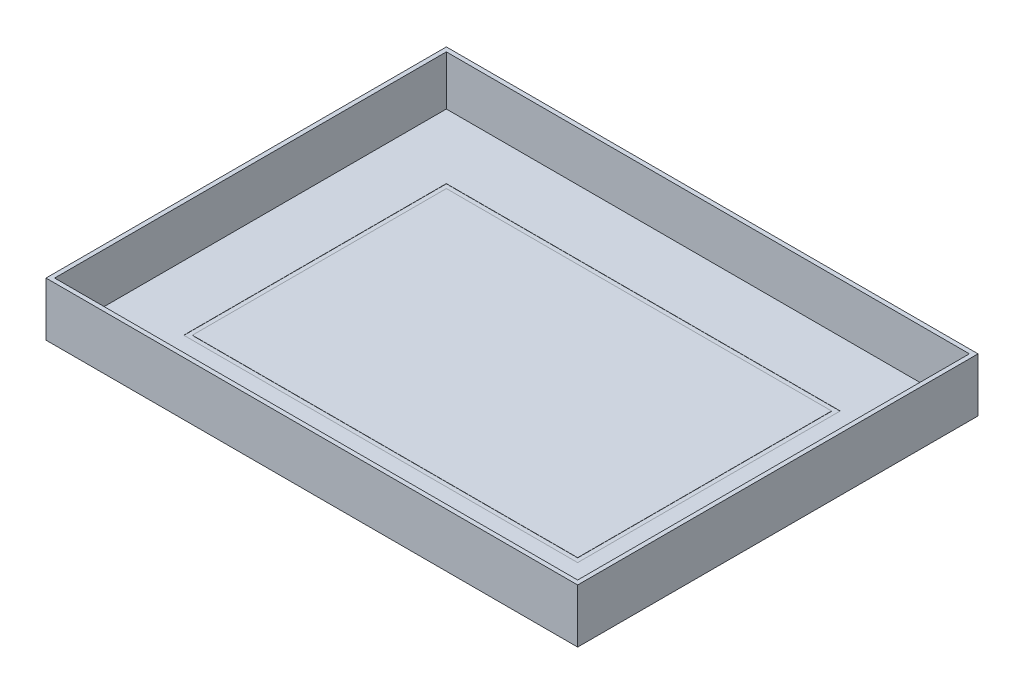
ISO-10303-21;
HEADER;
FILE_DESCRIPTION(('STEP AP214'),'2;1');
FILE_NAME('part.step','',(''),(''),'','','');
FILE_SCHEMA(('AUTOMOTIVE_DESIGN { 1 0 10303 214 1 1 1 1 }'));
ENDSEC;
DATA;
#1=APPLICATION_CONTEXT('core data for automotive mechanical design processes');
#2=APPLICATION_PROTOCOL_DEFINITION('international standard','automotive_design',2000,#1);
#3=PRODUCT_CONTEXT('',#1,'mechanical');
#4=PRODUCT('Part','Part','',(#3));
#5=PRODUCT_RELATED_PRODUCT_CATEGORY('part','',(#4));
#6=PRODUCT_DEFINITION_FORMATION('','',#4);
#7=PRODUCT_DEFINITION_CONTEXT('part definition',#1,'design');
#8=PRODUCT_DEFINITION('design','',#6,#7);
#9=PRODUCT_DEFINITION_SHAPE('','',#8);
#10=(LENGTH_UNIT() NAMED_UNIT(*) SI_UNIT(.MILLI.,.METRE.));
#11=(NAMED_UNIT(*) PLANE_ANGLE_UNIT() SI_UNIT($,.RADIAN.));
#12=(NAMED_UNIT(*) SI_UNIT($,.STERADIAN.) SOLID_ANGLE_UNIT());
#13=UNCERTAINTY_MEASURE_WITH_UNIT(LENGTH_MEASURE(1.E-05),#10,'distance_accuracy_value','');
#14=(GEOMETRIC_REPRESENTATION_CONTEXT(3) GLOBAL_UNCERTAINTY_ASSIGNED_CONTEXT((#13)) GLOBAL_UNIT_ASSIGNED_CONTEXT((#10,
#11,#12)) REPRESENTATION_CONTEXT('',''));
#15=CARTESIAN_POINT('',(0.,0.,0.));
#16=DIRECTION('',(0.,0.,1.));
#17=DIRECTION('',(1.,0.,0.));
#18=AXIS2_PLACEMENT_3D('',#15,#16,#17);
#19=CARTESIAN_POINT('',(0.,230.,-910.));
#20=DIRECTION('',(0.,0.,-1.));
#21=DIRECTION('',(-1.,0.,0.));
#22=AXIS2_PLACEMENT_3D('',#19,#20,#21);
#23=PLANE('',#22);
#24=DIRECTION('',(1.,0.,0.));
#25=VECTOR('',#24,1.);
#26=CARTESIAN_POINT('',(0.,0.,-910.));
#27=LINE('',#26,#25);
#28=CARTESIAN_POINT('',(-1215.,0.,-910.));
#29=VERTEX_POINT('',#28);
#30=CARTESIAN_POINT('',(1215.,0.,-910.));
#31=VERTEX_POINT('',#30);
#32=EDGE_CURVE('E403',#29,#31,#27,.T.);
#33=ORIENTED_EDGE('',*,*,#32,.T.);
#34=DIRECTION('',(0.,-1.,0.));
#35=VECTOR('',#34,1.);
#36=CARTESIAN_POINT('',(1215.,230.,-910.));
#37=LINE('',#36,#35);
#38=CARTESIAN_POINT('',(1215.,230.,-910.));
#39=VERTEX_POINT('',#38);
#40=EDGE_CURVE('E11',#39,#31,#37,.T.);
#41=ORIENTED_EDGE('',*,*,#40,.F.);
#42=DIRECTION('',(1.,0.,0.));
#43=VECTOR('',#42,1.);
#44=CARTESIAN_POINT('',(0.,230.,-910.));
#45=LINE('',#44,#43);
#46=CARTESIAN_POINT('',(-1215.,230.,-910.));
#47=VERTEX_POINT('',#46);
#48=EDGE_CURVE('E414',#47,#39,#45,.T.);
#49=ORIENTED_EDGE('',*,*,#48,.F.);
#50=DIRECTION('',(0.,-1.,0.));
#51=VECTOR('',#50,1.);
#52=CARTESIAN_POINT('',(-1215.,230.,-910.));
#53=LINE('',#52,#51);
#54=EDGE_CURVE('E434',#47,#29,#53,.T.);
#55=ORIENTED_EDGE('',*,*,#54,.T.);
#56=EDGE_LOOP('',(#33,#41,#49,#55));
#57=FACE_BOUND('',#56,.T.);
#58=ADVANCED_FACE('F39',(#57),#23,.F.);
#59=CARTESIAN_POINT('',(1215.,230.,-4.44699222500956E-13));
#60=DIRECTION('',(1.,0.,0.));
#61=DIRECTION('',(0.,0.,-1.));
#62=AXIS2_PLACEMENT_3D('',#59,#60,#61);
#63=PLANE('',#62);
#64=DIRECTION('',(0.,0.,1.));
#65=VECTOR('',#64,1.);
#66=CARTESIAN_POINT('',(1215.,0.,-4.44699222500956E-13));
#67=LINE('',#66,#65);
#68=CARTESIAN_POINT('',(1215.,0.,910.));
#69=VERTEX_POINT('',#68);
#70=EDGE_CURVE('E426',#31,#69,#67,.T.);
#71=ORIENTED_EDGE('',*,*,#70,.T.);
#72=DIRECTION('',(0.,-1.,0.));
#73=VECTOR('',#72,1.);
#74=CARTESIAN_POINT('',(1215.,230.,910.));
#75=LINE('',#74,#73);
#76=CARTESIAN_POINT('',(1215.,230.,910.));
#77=VERTEX_POINT('',#76);
#78=EDGE_CURVE('E48',#77,#69,#75,.T.);
#79=ORIENTED_EDGE('',*,*,#78,.F.);
#80=DIRECTION('',(0.,0.,1.));
#81=VECTOR('',#80,1.);
#82=CARTESIAN_POINT('',(1215.,230.,-4.44699222500956E-13));
#83=LINE('',#82,#81);
#84=EDGE_CURVE('E417',#39,#77,#83,.T.);
#85=ORIENTED_EDGE('',*,*,#84,.F.);
#86=ORIENTED_EDGE('',*,*,#40,.T.);
#87=EDGE_LOOP('',(#71,#79,#85,#86));
#88=FACE_BOUND('',#87,.T.);
#89=ADVANCED_FACE('F479',(#88),#63,.F.);
#90=CARTESIAN_POINT('',(1.66305012742204E-13,230.,910.));
#91=DIRECTION('',(0.,0.,1.));
#92=DIRECTION('',(1.,0.,0.));
#93=AXIS2_PLACEMENT_3D('',#90,#91,#92);
#94=PLANE('',#93);
#95=DIRECTION('',(-1.,0.,0.));
#96=VECTOR('',#95,1.);
#97=CARTESIAN_POINT('',(1.66305012742204E-13,0.,910.));
#98=LINE('',#97,#96);
#99=CARTESIAN_POINT('',(-1215.,0.,910.));
#100=VERTEX_POINT('',#99);
#101=EDGE_CURVE('E429',#69,#100,#98,.T.);
#102=ORIENTED_EDGE('',*,*,#101,.T.);
#103=DIRECTION('',(0.,-1.,0.));
#104=VECTOR('',#103,1.);
#105=CARTESIAN_POINT('',(-1215.,230.,910.));
#106=LINE('',#105,#104);
#107=CARTESIAN_POINT('',(-1215.,230.,910.));
#108=VERTEX_POINT('',#107);
#109=EDGE_CURVE('E437',#108,#100,#106,.T.);
#110=ORIENTED_EDGE('',*,*,#109,.F.);
#111=DIRECTION('',(-1.,0.,0.));
#112=VECTOR('',#111,1.);
#113=CARTESIAN_POINT('',(1.66305012742204E-13,230.,910.));
#114=LINE('',#113,#112);
#115=EDGE_CURVE('E419',#77,#108,#114,.T.);
#116=ORIENTED_EDGE('',*,*,#115,.F.);
#117=ORIENTED_EDGE('',*,*,#78,.T.);
#118=EDGE_LOOP('',(#102,#110,#116,#117));
#119=FACE_BOUND('',#118,.T.);
#120=ADVANCED_FACE('F483',(#119),#94,.F.);
#121=CARTESIAN_POINT('',(1.67207678202655E-13,230.,930.));
#122=DIRECTION('',(0.,0.,-1.));
#123=DIRECTION('',(-1.,0.,0.));
#124=AXIS2_PLACEMENT_3D('',#121,#122,#123);
#125=PLANE('',#124);
#126=DIRECTION('',(0.,-1.,0.));
#127=VECTOR('',#126,1.);
#128=CARTESIAN_POINT('',(-1235.,230.,930.));
#129=LINE('',#128,#127);
#130=CARTESIAN_POINT('',(-1235.,230.,930.));
#131=VERTEX_POINT('',#130);
#132=CARTESIAN_POINT('',(-1235.,-20.,930.));
#133=VERTEX_POINT('',#132);
#134=EDGE_CURVE('E423',#131,#133,#129,.T.);
#135=ORIENTED_EDGE('',*,*,#134,.T.);
#136=DIRECTION('',(1.,0.,0.));
#137=VECTOR('',#136,1.);
#138=CARTESIAN_POINT('',(-1235.,-20.,930.));
#139=LINE('',#138,#137);
#140=CARTESIAN_POINT('',(1235.,-20.,930.));
#141=VERTEX_POINT('',#140);
#142=EDGE_CURVE('E400',#133,#141,#139,.T.);
#143=ORIENTED_EDGE('',*,*,#142,.T.);
#144=DIRECTION('',(0.,-1.,0.));
#145=VECTOR('',#144,1.);
#146=CARTESIAN_POINT('',(1235.,230.,930.));
#147=LINE('',#146,#145);
#148=CARTESIAN_POINT('',(1235.,230.,930.));
#149=VERTEX_POINT('',#148);
#150=EDGE_CURVE('E43',#149,#141,#147,.T.);
#151=ORIENTED_EDGE('',*,*,#150,.F.);
#152=DIRECTION('',(1.,0.,0.));
#153=VECTOR('',#152,1.);
#154=CARTESIAN_POINT('',(1.67207678202655E-13,230.,930.));
#155=LINE('',#154,#153);
#156=EDGE_CURVE('E404',#131,#149,#155,.T.);
#157=ORIENTED_EDGE('',*,*,#156,.F.);
#158=EDGE_LOOP('',(#135,#143,#151,#157));
#159=FACE_BOUND('',#158,.T.);
#160=ADVANCED_FACE('F41',(#159),#125,.F.);
#161=CARTESIAN_POINT('',(1235.,230.,-2.94865685034853E-13));
#162=DIRECTION('',(-1.,0.,0.));
#163=DIRECTION('',(0.,0.,1.));
#164=AXIS2_PLACEMENT_3D('',#161,#162,#163);
#165=PLANE('',#164);
#166=ORIENTED_EDGE('',*,*,#150,.T.);
#167=DIRECTION('',(0.,0.,-1.));
#168=VECTOR('',#167,1.);
#169=CARTESIAN_POINT('',(1235.,-20.,930.));
#170=LINE('',#169,#168);
#171=CARTESIAN_POINT('',(1235.,-20.,-930.));
#172=VERTEX_POINT('',#171);
#173=EDGE_CURVE('E356',#141,#172,#170,.T.);
#174=ORIENTED_EDGE('',*,*,#173,.T.);
#175=DIRECTION('',(0.,-1.,0.));
#176=VECTOR('',#175,1.);
#177=CARTESIAN_POINT('',(1235.,230.,-930.));
#178=LINE('',#177,#176);
#179=CARTESIAN_POINT('',(1235.,230.,-930.));
#180=VERTEX_POINT('',#179);
#181=EDGE_CURVE('E444',#180,#172,#178,.T.);
#182=ORIENTED_EDGE('',*,*,#181,.F.);
#183=DIRECTION('',(0.,0.,-1.));
#184=VECTOR('',#183,1.);
#185=CARTESIAN_POINT('',(1235.,230.,-2.94865685034853E-13));
#186=LINE('',#185,#184);
#187=EDGE_CURVE('E407',#149,#180,#186,.T.);
#188=ORIENTED_EDGE('',*,*,#187,.F.);
#189=EDGE_LOOP('',(#166,#174,#182,#188));
#190=FACE_BOUND('',#189,.T.);
#191=ADVANCED_FACE('F452',(#190),#165,.F.);
#192=CARTESIAN_POINT('',(-1.25405758651991E-13,230.,-930.));
#193=DIRECTION('',(0.,0.,1.));
#194=DIRECTION('',(1.,0.,0.));
#195=AXIS2_PLACEMENT_3D('',#192,#193,#194);
#196=PLANE('',#195);
#197=ORIENTED_EDGE('',*,*,#181,.T.);
#198=DIRECTION('',(-1.,0.,0.));
#199=VECTOR('',#198,1.);
#200=CARTESIAN_POINT('',(1235.,-20.,-930.));
#201=LINE('',#200,#199);
#202=CARTESIAN_POINT('',(-1235.,-20.,-930.));
#203=VERTEX_POINT('',#202);
#204=EDGE_CURVE('E394',#172,#203,#201,.T.);
#205=ORIENTED_EDGE('',*,*,#204,.T.);
#206=DIRECTION('',(0.,-1.,0.));
#207=VECTOR('',#206,1.);
#208=CARTESIAN_POINT('',(-1235.,230.,-930.));
#209=LINE('',#208,#207);
#210=CARTESIAN_POINT('',(-1235.,230.,-930.));
#211=VERTEX_POINT('',#210);
#212=EDGE_CURVE('E443',#211,#203,#209,.T.);
#213=ORIENTED_EDGE('',*,*,#212,.F.);
#214=DIRECTION('',(-1.,0.,0.));
#215=VECTOR('',#214,1.);
#216=CARTESIAN_POINT('',(-1.25405758651991E-13,230.,-930.));
#217=LINE('',#216,#215);
#218=EDGE_CURVE('E410',#180,#211,#217,.T.);
#219=ORIENTED_EDGE('',*,*,#218,.F.);
#220=EDGE_LOOP('',(#197,#205,#213,#219));
#221=FACE_BOUND('',#220,.T.);
#222=ADVANCED_FACE('F464',(#221),#196,.F.);
#223=CARTESIAN_POINT('',(-1235.,230.,0.));
#224=DIRECTION('',(1.,0.,0.));
#225=DIRECTION('',(0.,0.,-1.));
#226=AXIS2_PLACEMENT_3D('',#223,#224,#225);
#227=PLANE('',#226);
#228=ORIENTED_EDGE('',*,*,#212,.T.);
#229=DIRECTION('',(0.,0.,1.));
#230=VECTOR('',#229,1.);
#231=CARTESIAN_POINT('',(-1235.,-20.,-930.));
#232=LINE('',#231,#230);
#233=EDGE_CURVE('E397',#203,#133,#232,.T.);
#234=ORIENTED_EDGE('',*,*,#233,.T.);
#235=ORIENTED_EDGE('',*,*,#134,.F.);
#236=DIRECTION('',(0.,0.,1.));
#237=VECTOR('',#236,1.);
#238=CARTESIAN_POINT('',(-1235.,230.,0.));
#239=LINE('',#238,#237);
#240=EDGE_CURVE('E412',#211,#131,#239,.T.);
#241=ORIENTED_EDGE('',*,*,#240,.F.);
#242=EDGE_LOOP('',(#228,#234,#235,#241));
#243=FACE_BOUND('',#242,.T.);
#244=ADVANCED_FACE('F462',(#243),#227,.F.);
#245=CARTESIAN_POINT('',(-1215.,230.,1.48233074166985E-13));
#246=DIRECTION('',(-1.,0.,0.));
#247=DIRECTION('',(0.,0.,1.));
#248=AXIS2_PLACEMENT_3D('',#245,#246,#247);
#249=PLANE('',#248);
#250=DIRECTION('',(0.,0.,-1.));
#251=VECTOR('',#250,1.);
#252=CARTESIAN_POINT('',(-1215.,0.,1.48233074166985E-13));
#253=LINE('',#252,#251);
#254=EDGE_CURVE('E408',#100,#29,#253,.T.);
#255=ORIENTED_EDGE('',*,*,#254,.T.);
#256=ORIENTED_EDGE('',*,*,#54,.F.);
#257=DIRECTION('',(0.,0.,-1.));
#258=VECTOR('',#257,1.);
#259=CARTESIAN_POINT('',(-1215.,230.,1.48233074166985E-13));
#260=LINE('',#259,#258);
#261=EDGE_CURVE('E421',#108,#47,#260,.T.);
#262=ORIENTED_EDGE('',*,*,#261,.F.);
#263=ORIENTED_EDGE('',*,*,#109,.T.);
#264=EDGE_LOOP('',(#255,#256,#262,#263));
#265=FACE_BOUND('',#264,.T.);
#266=ADVANCED_FACE('F470',(#265),#249,.F.);
#267=CARTESIAN_POINT('',(0.,230.,0.));
#268=DIRECTION('',(0.,1.,0.));
#269=DIRECTION('',(0.,0.,1.));
#270=AXIS2_PLACEMENT_3D('',#267,#268,#269);
#271=PLANE('',#270);
#272=ORIENTED_EDGE('',*,*,#156,.T.);
#273=ORIENTED_EDGE('',*,*,#187,.T.);
#274=ORIENTED_EDGE('',*,*,#218,.T.);
#275=ORIENTED_EDGE('',*,*,#240,.T.);
#276=EDGE_LOOP('',(#272,#273,#274,#275));
#277=FACE_BOUND('',#276,.T.);
#278=ORIENTED_EDGE('',*,*,#48,.T.);
#279=ORIENTED_EDGE('',*,*,#84,.T.);
#280=ORIENTED_EDGE('',*,*,#115,.T.);
#281=ORIENTED_EDGE('',*,*,#261,.T.);
#282=EDGE_LOOP('',(#278,#279,#280,#281));
#283=FACE_BOUND('',#282,.T.);
#284=ADVANCED_FACE('F466',(#277,#283),#271,.T.);
#285=CARTESIAN_POINT('',(0.,0.,0.));
#286=DIRECTION('',(0.,1.,0.));
#287=DIRECTION('',(0.,0.,1.));
#288=AXIS2_PLACEMENT_3D('',#285,#286,#287);
#289=PLANE('',#288);
#290=CARTESIAN_POINT('',(914.9999,0.,9.99999999289457E-05));
#291=DIRECTION('',(0.,1.,0.));
#292=DIRECTION('',(0.,0.,1.));
#293=AXIS2_PLACEMENT_3D('',#290,#291,#292);
#294=CIRCLE('',#293,9.99999999736822E-05);
#295=CARTESIAN_POINT('',(915.,0.,9.99999999289464E-05));
#296=VERTEX_POINT('',#295);
#297=CARTESIAN_POINT('',(914.9999,0.,0.));
#298=VERTEX_POINT('',#297);
#299=EDGE_CURVE('E64',#296,#298,#294,.T.);
#300=ORIENTED_EDGE('',*,*,#299,.F.);
#301=DIRECTION('',(0.,0.,-1.));
#302=VECTOR('',#301,1.);
#303=CARTESIAN_POINT('',(915.,0.,0.));
#304=LINE('',#303,#302);
#305=CARTESIAN_POINT('',(915.,0.,610.));
#306=VERTEX_POINT('',#305);
#307=EDGE_CURVE('E249',#306,#296,#304,.T.);
#308=ORIENTED_EDGE('',*,*,#307,.F.);
#309=DIRECTION('',(1.,0.,0.));
#310=VECTOR('',#309,1.);
#311=CARTESIAN_POINT('',(0.,0.,610.));
#312=LINE('',#311,#310);
#313=CARTESIAN_POINT('',(-915.,0.,610.));
#314=VERTEX_POINT('',#313);
#315=EDGE_CURVE('E252',#314,#306,#312,.T.);
#316=ORIENTED_EDGE('',*,*,#315,.F.);
#317=DIRECTION('',(0.,0.,1.));
#318=VECTOR('',#317,1.);
#319=CARTESIAN_POINT('',(-915.,0.,0.));
#320=LINE('',#319,#318);
#321=CARTESIAN_POINT('',(-915.,0.,0.000100000000071055));
#322=VERTEX_POINT('',#321);
#323=EDGE_CURVE('E349',#322,#314,#320,.T.);
#324=ORIENTED_EDGE('',*,*,#323,.F.);
#325=CARTESIAN_POINT('',(-914.9999,0.,0.000100000000071054));
#326=DIRECTION('',(0.,1.,0.));
#327=DIRECTION('',(0.,0.,1.));
#328=AXIS2_PLACEMENT_3D('',#325,#326,#327);
#329=CIRCLE('',#328,9.99999999736822E-05);
#330=CARTESIAN_POINT('',(-914.9999,0.,0.));
#331=VERTEX_POINT('',#330);
#332=EDGE_CURVE('E346',#331,#322,#329,.T.);
#333=ORIENTED_EDGE('',*,*,#332,.F.);
#334=CARTESIAN_POINT('',(-914.9999,0.,-9.99999999089618E-05));
#335=DIRECTION('',(0.,1.,0.));
#336=DIRECTION('',(0.,0.,1.));
#337=AXIS2_PLACEMENT_3D('',#334,#335,#336);
#338=CIRCLE('',#337,9.99999999736822E-05);
#339=CARTESIAN_POINT('',(-915.,0.,-9.99999999089625E-05));
#340=VERTEX_POINT('',#339);
#341=EDGE_CURVE('E343',#340,#331,#338,.T.);
#342=ORIENTED_EDGE('',*,*,#341,.F.);
#343=DIRECTION('',(0.,0.,1.));
#344=VECTOR('',#343,1.);
#345=CARTESIAN_POINT('',(-915.,0.,0.));
#346=LINE('',#345,#344);
#347=CARTESIAN_POINT('',(-915.,0.,-610.));
#348=VERTEX_POINT('',#347);
#349=EDGE_CURVE('E340',#348,#340,#346,.T.);
#350=ORIENTED_EDGE('',*,*,#349,.F.);
#351=DIRECTION('',(-1.,0.,0.));
#352=VECTOR('',#351,1.);
#353=CARTESIAN_POINT('',(0.,0.,-610.));
#354=LINE('',#353,#352);
#355=CARTESIAN_POINT('',(915.,0.,-610.));
#356=VERTEX_POINT('',#355);
#357=EDGE_CURVE('E337',#356,#348,#354,.T.);
#358=ORIENTED_EDGE('',*,*,#357,.F.);
#359=DIRECTION('',(0.,0.,-1.));
#360=VECTOR('',#359,1.);
#361=CARTESIAN_POINT('',(915.,0.,0.));
#362=LINE('',#361,#360);
#363=CARTESIAN_POINT('',(915.,0.,-0.000100000000071055));
#364=VERTEX_POINT('',#363);
#365=EDGE_CURVE('E334',#364,#356,#362,.T.);
#366=ORIENTED_EDGE('',*,*,#365,.F.);
#367=CARTESIAN_POINT('',(914.9999,0.,-0.000100000000071054));
#368=DIRECTION('',(0.,1.,0.));
#369=DIRECTION('',(0.,0.,1.));
#370=AXIS2_PLACEMENT_3D('',#367,#368,#369);
#371=CIRCLE('',#370,9.99999999736822E-05);
#372=EDGE_CURVE('E331',#298,#364,#371,.T.);
#373=ORIENTED_EDGE('',*,*,#372,.F.);
#374=EDGE_LOOP('',(#300,#308,#316,#324,#333,#342,#350,#358,#366,#373));
#375=FACE_BOUND('',#374,.T.);
#376=ORIENTED_EDGE('',*,*,#32,.F.);
#377=ORIENTED_EDGE('',*,*,#254,.F.);
#378=ORIENTED_EDGE('',*,*,#101,.F.);
#379=ORIENTED_EDGE('',*,*,#70,.F.);
#380=EDGE_LOOP('',(#376,#377,#378,#379));
#381=FACE_BOUND('',#380,.T.);
#382=ADVANCED_FACE('F469',(#375,#381),#289,.T.);
#383=CARTESIAN_POINT('',(0.,-20.,0.));
#384=DIRECTION('',(0.,1.,0.));
#385=DIRECTION('',(0.,0.,1.));
#386=AXIS2_PLACEMENT_3D('',#383,#384,#385);
#387=PLANE('',#386);
#388=ORIENTED_EDGE('',*,*,#173,.F.);
#389=ORIENTED_EDGE('',*,*,#142,.F.);
#390=ORIENTED_EDGE('',*,*,#233,.F.);
#391=ORIENTED_EDGE('',*,*,#204,.F.);
#392=EDGE_LOOP('',(#388,#389,#390,#391));
#393=FACE_BOUND('',#392,.T.);
#394=ADVANCED_FACE('F457',(#393),#387,.F.);
#395=CARTESIAN_POINT('',(914.9999,-1.,9.99999999289457E-05));
#396=DIRECTION('',(0.,1.,0.));
#397=DIRECTION('',(0.,0.,1.));
#398=AXIS2_PLACEMENT_3D('',#395,#396,#397);
#399=CYLINDRICAL_SURFACE('',#398,9.99999999736822E-05);
#400=ORIENTED_EDGE('',*,*,#299,.T.);
#401=DIRECTION('',(0.,1.,0.));
#402=VECTOR('',#401,1.);
#403=CARTESIAN_POINT('',(914.9999,-1.,0.));
#404=LINE('',#403,#402);
#405=CARTESIAN_POINT('',(914.9999,-1.,0.));
#406=VERTEX_POINT('',#405);
#407=EDGE_CURVE('E373',#406,#298,#404,.T.);
#408=ORIENTED_EDGE('',*,*,#407,.F.);
#409=CARTESIAN_POINT('',(914.9999,-1.,9.99999999289457E-05));
#410=DIRECTION('',(0.,1.,0.));
#411=DIRECTION('',(0.,0.,1.));
#412=AXIS2_PLACEMENT_3D('',#409,#410,#411);
#413=CIRCLE('',#412,9.99999999736822E-05);
#414=CARTESIAN_POINT('',(915.,-1.,9.99999999289464E-05));
#415=VERTEX_POINT('',#414);
#416=EDGE_CURVE('E274',#415,#406,#413,.T.);
#417=ORIENTED_EDGE('',*,*,#416,.F.);
#418=DIRECTION('',(0.,1.,0.));
#419=VECTOR('',#418,1.);
#420=CARTESIAN_POINT('',(915.,-1.,9.99999999289464E-05));
#421=LINE('',#420,#419);
#422=EDGE_CURVE('E354',#415,#296,#421,.T.);
#423=ORIENTED_EDGE('',*,*,#422,.T.);
#424=EDGE_LOOP('',(#400,#408,#417,#423));
#425=FACE_BOUND('',#424,.T.);
#426=ADVANCED_FACE('F493',(#425),#399,.F.);
#427=CARTESIAN_POINT('',(915.,-1.,0.));
#428=DIRECTION('',(1.,0.,0.));
#429=DIRECTION('',(0.,0.,-1.));
#430=AXIS2_PLACEMENT_3D('',#427,#428,#429);
#431=PLANE('',#430);
#432=ORIENTED_EDGE('',*,*,#307,.T.);
#433=ORIENTED_EDGE('',*,*,#422,.F.);
#434=DIRECTION('',(0.,0.,-1.));
#435=VECTOR('',#434,1.);
#436=CARTESIAN_POINT('',(915.,-1.,0.));
#437=LINE('',#436,#435);
#438=CARTESIAN_POINT('',(915.,-1.,610.));
#439=VERTEX_POINT('',#438);
#440=EDGE_CURVE('E234',#439,#415,#437,.T.);
#441=ORIENTED_EDGE('',*,*,#440,.F.);
#442=DIRECTION('',(0.,1.,0.));
#443=VECTOR('',#442,1.);
#444=CARTESIAN_POINT('',(915.,-1.,610.));
#445=LINE('',#444,#443);
#446=EDGE_CURVE('E357',#439,#306,#445,.T.);
#447=ORIENTED_EDGE('',*,*,#446,.T.);
#448=EDGE_LOOP('',(#432,#433,#441,#447));
#449=FACE_BOUND('',#448,.T.);
#450=ADVANCED_FACE('F591',(#449),#431,.F.);
#451=CARTESIAN_POINT('',(0.,-1.,610.));
#452=DIRECTION('',(0.,0.,1.));
#453=DIRECTION('',(1.,0.,0.));
#454=AXIS2_PLACEMENT_3D('',#451,#452,#453);
#455=PLANE('',#454);
#456=ORIENTED_EDGE('',*,*,#315,.T.);
#457=ORIENTED_EDGE('',*,*,#446,.F.);
#458=DIRECTION('',(1.,0.,0.));
#459=VECTOR('',#458,1.);
#460=CARTESIAN_POINT('',(0.,-1.,610.));
#461=LINE('',#460,#459);
#462=CARTESIAN_POINT('',(-915.,-1.,610.));
#463=VERTEX_POINT('',#462);
#464=EDGE_CURVE('E298',#463,#439,#461,.T.);
#465=ORIENTED_EDGE('',*,*,#464,.F.);
#466=DIRECTION('',(0.,1.,0.));
#467=VECTOR('',#466,1.);
#468=CARTESIAN_POINT('',(-915.,-1.,610.));
#469=LINE('',#468,#467);
#470=EDGE_CURVE('E359',#463,#314,#469,.T.);
#471=ORIENTED_EDGE('',*,*,#470,.T.);
#472=EDGE_LOOP('',(#456,#457,#465,#471));
#473=FACE_BOUND('',#472,.T.);
#474=ADVANCED_FACE('F599',(#473),#455,.F.);
#475=CARTESIAN_POINT('',(-915.,-1.,0.));
#476=DIRECTION('',(-1.,0.,0.));
#477=DIRECTION('',(0.,0.,1.));
#478=AXIS2_PLACEMENT_3D('',#475,#476,#477);
#479=PLANE('',#478);
#480=ORIENTED_EDGE('',*,*,#323,.T.);
#481=ORIENTED_EDGE('',*,*,#470,.F.);
#482=DIRECTION('',(0.,0.,1.));
#483=VECTOR('',#482,1.);
#484=CARTESIAN_POINT('',(-915.,-1.,0.));
#485=LINE('',#484,#483);
#486=CARTESIAN_POINT('',(-915.,-1.,0.000100000000071055));
#487=VERTEX_POINT('',#486);
#488=EDGE_CURVE('E295',#487,#463,#485,.T.);
#489=ORIENTED_EDGE('',*,*,#488,.F.);
#490=DIRECTION('',(0.,1.,0.));
#491=VECTOR('',#490,1.);
#492=CARTESIAN_POINT('',(-915.,-1.,0.000100000000071055));
#493=LINE('',#492,#491);
#494=EDGE_CURVE('E361',#487,#322,#493,.T.);
#495=ORIENTED_EDGE('',*,*,#494,.T.);
#496=EDGE_LOOP('',(#480,#481,#489,#495));
#497=FACE_BOUND('',#496,.T.);
#498=ADVANCED_FACE('F608',(#497),#479,.F.);
#499=CARTESIAN_POINT('',(-914.9999,-1.,0.000100000000071054));
#500=DIRECTION('',(0.,1.,0.));
#501=DIRECTION('',(0.,0.,1.));
#502=AXIS2_PLACEMENT_3D('',#499,#500,#501);
#503=CYLINDRICAL_SURFACE('',#502,9.99999999736822E-05);
#504=ORIENTED_EDGE('',*,*,#332,.T.);
#505=ORIENTED_EDGE('',*,*,#494,.F.);
#506=CARTESIAN_POINT('',(-914.9999,-1.,0.000100000000071054));
#507=DIRECTION('',(0.,1.,0.));
#508=DIRECTION('',(0.,0.,1.));
#509=AXIS2_PLACEMENT_3D('',#506,#507,#508);
#510=CIRCLE('',#509,9.99999999736822E-05);
#511=CARTESIAN_POINT('',(-914.9999,-1.,0.));
#512=VERTEX_POINT('',#511);
#513=EDGE_CURVE('E292',#512,#487,#510,.T.);
#514=ORIENTED_EDGE('',*,*,#513,.F.);
#515=DIRECTION('',(0.,1.,0.));
#516=VECTOR('',#515,1.);
#517=CARTESIAN_POINT('',(-914.9999,-1.,0.));
#518=LINE('',#517,#516);
#519=EDGE_CURVE('E363',#512,#331,#518,.T.);
#520=ORIENTED_EDGE('',*,*,#519,.T.);
#521=EDGE_LOOP('',(#504,#505,#514,#520));
#522=FACE_BOUND('',#521,.T.);
#523=ADVANCED_FACE('F617',(#522),#503,.F.);
#524=CARTESIAN_POINT('',(-914.9999,-1.,-9.99999999089618E-05));
#525=DIRECTION('',(0.,1.,0.));
#526=DIRECTION('',(0.,0.,1.));
#527=AXIS2_PLACEMENT_3D('',#524,#525,#526);
#528=CYLINDRICAL_SURFACE('',#527,9.99999999736822E-05);
#529=ORIENTED_EDGE('',*,*,#341,.T.);
#530=ORIENTED_EDGE('',*,*,#519,.F.);
#531=CARTESIAN_POINT('',(-914.9999,-1.,-9.99999999089618E-05));
#532=DIRECTION('',(0.,1.,0.));
#533=DIRECTION('',(0.,0.,1.));
#534=AXIS2_PLACEMENT_3D('',#531,#532,#533);
#535=CIRCLE('',#534,9.99999999736822E-05);
#536=CARTESIAN_POINT('',(-915.,-1.,-9.99999999089625E-05));
#537=VERTEX_POINT('',#536);
#538=EDGE_CURVE('E289',#537,#512,#535,.T.);
#539=ORIENTED_EDGE('',*,*,#538,.F.);
#540=DIRECTION('',(0.,1.,0.));
#541=VECTOR('',#540,1.);
#542=CARTESIAN_POINT('',(-915.,-1.,-9.99999999089625E-05));
#543=LINE('',#542,#541);
#544=EDGE_CURVE('E365',#537,#340,#543,.T.);
#545=ORIENTED_EDGE('',*,*,#544,.T.);
#546=EDGE_LOOP('',(#529,#530,#539,#545));
#547=FACE_BOUND('',#546,.T.);
#548=ADVANCED_FACE('F626',(#547),#528,.F.);
#549=CARTESIAN_POINT('',(-915.,-1.,0.));
#550=DIRECTION('',(-1.,0.,0.));
#551=DIRECTION('',(0.,0.,1.));
#552=AXIS2_PLACEMENT_3D('',#549,#550,#551);
#553=PLANE('',#552);
#554=ORIENTED_EDGE('',*,*,#349,.T.);
#555=ORIENTED_EDGE('',*,*,#544,.F.);
#556=DIRECTION('',(0.,0.,1.));
#557=VECTOR('',#556,1.);
#558=CARTESIAN_POINT('',(-915.,-1.,0.));
#559=LINE('',#558,#557);
#560=CARTESIAN_POINT('',(-915.,-1.,-610.));
#561=VERTEX_POINT('',#560);
#562=EDGE_CURVE('E286',#561,#537,#559,.T.);
#563=ORIENTED_EDGE('',*,*,#562,.F.);
#564=DIRECTION('',(0.,1.,0.));
#565=VECTOR('',#564,1.);
#566=CARTESIAN_POINT('',(-915.,-1.,-610.));
#567=LINE('',#566,#565);
#568=EDGE_CURVE('E367',#561,#348,#567,.T.);
#569=ORIENTED_EDGE('',*,*,#568,.T.);
#570=EDGE_LOOP('',(#554,#555,#563,#569));
#571=FACE_BOUND('',#570,.T.);
#572=ADVANCED_FACE('F635',(#571),#553,.F.);
#573=CARTESIAN_POINT('',(0.,-1.,-610.));
#574=DIRECTION('',(0.,0.,-1.));
#575=DIRECTION('',(-1.,0.,0.));
#576=AXIS2_PLACEMENT_3D('',#573,#574,#575);
#577=PLANE('',#576);
#578=ORIENTED_EDGE('',*,*,#357,.T.);
#579=ORIENTED_EDGE('',*,*,#568,.F.);
#580=DIRECTION('',(-1.,0.,0.));
#581=VECTOR('',#580,1.);
#582=CARTESIAN_POINT('',(0.,-1.,-610.));
#583=LINE('',#582,#581);
#584=CARTESIAN_POINT('',(915.,-1.,-610.));
#585=VERTEX_POINT('',#584);
#586=EDGE_CURVE('E283',#585,#561,#583,.T.);
#587=ORIENTED_EDGE('',*,*,#586,.F.);
#588=DIRECTION('',(0.,1.,0.));
#589=VECTOR('',#588,1.);
#590=CARTESIAN_POINT('',(915.,-1.,-610.));
#591=LINE('',#590,#589);
#592=EDGE_CURVE('E369',#585,#356,#591,.T.);
#593=ORIENTED_EDGE('',*,*,#592,.T.);
#594=EDGE_LOOP('',(#578,#579,#587,#593));
#595=FACE_BOUND('',#594,.T.);
#596=ADVANCED_FACE('F644',(#595),#577,.F.);
#597=CARTESIAN_POINT('',(915.,-1.,0.));
#598=DIRECTION('',(1.,0.,0.));
#599=DIRECTION('',(0.,0.,-1.));
#600=AXIS2_PLACEMENT_3D('',#597,#598,#599);
#601=PLANE('',#600);
#602=ORIENTED_EDGE('',*,*,#365,.T.);
#603=ORIENTED_EDGE('',*,*,#592,.F.);
#604=DIRECTION('',(0.,0.,-1.));
#605=VECTOR('',#604,1.);
#606=CARTESIAN_POINT('',(915.,-1.,0.));
#607=LINE('',#606,#605);
#608=CARTESIAN_POINT('',(915.,-1.,-0.000100000000071055));
#609=VERTEX_POINT('',#608);
#610=EDGE_CURVE('E280',#609,#585,#607,.T.);
#611=ORIENTED_EDGE('',*,*,#610,.F.);
#612=DIRECTION('',(0.,1.,0.));
#613=VECTOR('',#612,1.);
#614=CARTESIAN_POINT('',(915.,-1.,-0.000100000000071055));
#615=LINE('',#614,#613);
#616=EDGE_CURVE('E371',#609,#364,#615,.T.);
#617=ORIENTED_EDGE('',*,*,#616,.T.);
#618=EDGE_LOOP('',(#602,#603,#611,#617));
#619=FACE_BOUND('',#618,.T.);
#620=ADVANCED_FACE('F653',(#619),#601,.F.);
#621=CARTESIAN_POINT('',(895.0001,-1.,-0.000100000000090262));
#622=DIRECTION('',(0.,1.,0.));
#623=DIRECTION('',(0.,0.,1.));
#624=AXIS2_PLACEMENT_3D('',#621,#622,#623);
#625=CYLINDRICAL_SURFACE('',#624,9.99999999736822E-05);
#626=CARTESIAN_POINT('',(895.0001,0.,-0.000100000000090262));
#627=DIRECTION('',(0.,1.,0.));
#628=DIRECTION('',(0.,0.,1.));
#629=AXIS2_PLACEMENT_3D('',#626,#627,#628);
#630=CIRCLE('',#629,9.99999999736822E-05);
#631=CARTESIAN_POINT('',(895.,0.,-0.000100000000090262));
#632=VERTEX_POINT('',#631);
#633=CARTESIAN_POINT('',(895.0001,0.,0.));
#634=VERTEX_POINT('',#633);
#635=EDGE_CURVE('E56',#632,#634,#630,.T.);
#636=ORIENTED_EDGE('',*,*,#635,.T.);
#637=DIRECTION('',(0.,1.,0.));
#638=VECTOR('',#637,1.);
#639=CARTESIAN_POINT('',(895.0001,-1.,0.));
#640=LINE('',#639,#638);
#641=CARTESIAN_POINT('',(895.0001,-1.,0.));
#642=VERTEX_POINT('',#641);
#643=EDGE_CURVE('E224',#642,#634,#640,.T.);
#644=ORIENTED_EDGE('',*,*,#643,.F.);
#645=CARTESIAN_POINT('',(895.0001,-1.,-0.000100000000090262));
#646=DIRECTION('',(0.,1.,0.));
#647=DIRECTION('',(0.,0.,1.));
#648=AXIS2_PLACEMENT_3D('',#645,#646,#647);
#649=CIRCLE('',#648,9.99999999736822E-05);
#650=CARTESIAN_POINT('',(895.,-1.,-0.000100000000090262));
#651=VERTEX_POINT('',#650);
#652=EDGE_CURVE('E228',#651,#642,#649,.T.);
#653=ORIENTED_EDGE('',*,*,#652,.F.);
#654=DIRECTION('',(0.,1.,0.));
#655=VECTOR('',#654,1.);
#656=CARTESIAN_POINT('',(895.,-1.,-0.000100000000090262));
#657=LINE('',#656,#655);
#658=EDGE_CURVE('E375',#651,#632,#657,.T.);
#659=ORIENTED_EDGE('',*,*,#658,.T.);
#660=EDGE_LOOP('',(#636,#644,#653,#659));
#661=FACE_BOUND('',#660,.T.);
#662=ADVANCED_FACE('F226',(#661),#625,.F.);
#663=CARTESIAN_POINT('',(895.,-1.,0.));
#664=DIRECTION('',(-1.,0.,0.));
#665=DIRECTION('',(0.,0.,1.));
#666=AXIS2_PLACEMENT_3D('',#663,#664,#665);
#667=PLANE('',#666);
#668=DIRECTION('',(0.,0.,1.));
#669=VECTOR('',#668,1.);
#670=CARTESIAN_POINT('',(895.,0.,0.));
#671=LINE('',#670,#669);
#672=CARTESIAN_POINT('',(895.,0.,-590.));
#673=VERTEX_POINT('',#672);
#674=EDGE_CURVE('E327',#673,#632,#671,.T.);
#675=ORIENTED_EDGE('',*,*,#674,.T.);
#676=ORIENTED_EDGE('',*,*,#658,.F.);
#677=DIRECTION('',(0.,0.,1.));
#678=VECTOR('',#677,1.);
#679=CARTESIAN_POINT('',(895.,-1.,0.));
#680=LINE('',#679,#678);
#681=CARTESIAN_POINT('',(895.,-1.,-590.));
#682=VERTEX_POINT('',#681);
#683=EDGE_CURVE('E248',#682,#651,#680,.T.);
#684=ORIENTED_EDGE('',*,*,#683,.F.);
#685=DIRECTION('',(0.,1.,0.));
#686=VECTOR('',#685,1.);
#687=CARTESIAN_POINT('',(895.,-1.,-590.));
#688=LINE('',#687,#686);
#689=EDGE_CURVE('E377',#682,#673,#688,.T.);
#690=ORIENTED_EDGE('',*,*,#689,.T.);
#691=EDGE_LOOP('',(#675,#676,#684,#690));
#692=FACE_BOUND('',#691,.T.);
#693=ADVANCED_FACE('F670',(#692),#667,.F.);
#694=CARTESIAN_POINT('',(0.,-1.,-590.));
#695=DIRECTION('',(0.,0.,1.));
#696=DIRECTION('',(1.,0.,0.));
#697=AXIS2_PLACEMENT_3D('',#694,#695,#696);
#698=PLANE('',#697);
#699=DIRECTION('',(1.,0.,0.));
#700=VECTOR('',#699,1.);
#701=CARTESIAN_POINT('',(0.,0.,-590.));
#702=LINE('',#701,#700);
#703=CARTESIAN_POINT('',(-895.,0.,-590.));
#704=VERTEX_POINT('',#703);
#705=EDGE_CURVE('E324',#704,#673,#702,.T.);
#706=ORIENTED_EDGE('',*,*,#705,.T.);
#707=ORIENTED_EDGE('',*,*,#689,.F.);
#708=DIRECTION('',(1.,0.,0.));
#709=VECTOR('',#708,1.);
#710=CARTESIAN_POINT('',(0.,-1.,-590.));
#711=LINE('',#710,#709);
#712=CARTESIAN_POINT('',(-895.,-1.,-590.));
#713=VERTEX_POINT('',#712);
#714=EDGE_CURVE('E271',#713,#682,#711,.T.);
#715=ORIENTED_EDGE('',*,*,#714,.F.);
#716=DIRECTION('',(0.,1.,0.));
#717=VECTOR('',#716,1.);
#718=CARTESIAN_POINT('',(-895.,-1.,-590.));
#719=LINE('',#718,#717);
#720=EDGE_CURVE('E379',#713,#704,#719,.T.);
#721=ORIENTED_EDGE('',*,*,#720,.T.);
#722=EDGE_LOOP('',(#706,#707,#715,#721));
#723=FACE_BOUND('',#722,.T.);
#724=ADVANCED_FACE('F678',(#723),#698,.F.);
#725=CARTESIAN_POINT('',(-895.,-1.,1.68415216178768E-13));
#726=DIRECTION('',(1.,0.,0.));
#727=DIRECTION('',(0.,0.,-1.));
#728=AXIS2_PLACEMENT_3D('',#725,#726,#727);
#729=PLANE('',#728);
#730=DIRECTION('',(0.,0.,-1.));
#731=VECTOR('',#730,1.);
#732=CARTESIAN_POINT('',(-895.,0.,1.68415216178768E-13));
#733=LINE('',#732,#731);
#734=CARTESIAN_POINT('',(-895.,0.,-9.99999999289464E-05));
#735=VERTEX_POINT('',#734);
#736=EDGE_CURVE('E321',#735,#704,#733,.T.);
#737=ORIENTED_EDGE('',*,*,#736,.T.);
#738=ORIENTED_EDGE('',*,*,#720,.F.);
#739=DIRECTION('',(0.,0.,-1.));
#740=VECTOR('',#739,1.);
#741=CARTESIAN_POINT('',(-895.,-1.,1.68415216178768E-13));
#742=LINE('',#741,#740);
#743=CARTESIAN_POINT('',(-895.,-1.,-9.99999999289464E-05));
#744=VERTEX_POINT('',#743);
#745=EDGE_CURVE('E268',#744,#713,#742,.T.);
#746=ORIENTED_EDGE('',*,*,#745,.F.);
#747=DIRECTION('',(0.,1.,0.));
#748=VECTOR('',#747,1.);
#749=CARTESIAN_POINT('',(-895.,-1.,-9.99999999289464E-05));
#750=LINE('',#749,#748);
#751=EDGE_CURVE('E381',#744,#735,#750,.T.);
#752=ORIENTED_EDGE('',*,*,#751,.T.);
#753=EDGE_LOOP('',(#737,#738,#746,#752));
#754=FACE_BOUND('',#753,.T.);
#755=ADVANCED_FACE('F687',(#754),#729,.F.);
#756=CARTESIAN_POINT('',(-895.0001,-1.,-9.99999999289457E-05));
#757=DIRECTION('',(0.,1.,0.));
#758=DIRECTION('',(0.,0.,1.));
#759=AXIS2_PLACEMENT_3D('',#756,#757,#758);
#760=CYLINDRICAL_SURFACE('',#759,9.99999999736822E-05);
#761=CARTESIAN_POINT('',(-895.0001,0.,-9.99999999289457E-05));
#762=DIRECTION('',(0.,1.,0.));
#763=DIRECTION('',(0.,0.,1.));
#764=AXIS2_PLACEMENT_3D('',#761,#762,#763);
#765=CIRCLE('',#764,9.99999999736822E-05);
#766=CARTESIAN_POINT('',(-895.0001,0.,0.));
#767=VERTEX_POINT('',#766);
#768=EDGE_CURVE('E318',#767,#735,#765,.T.);
#769=ORIENTED_EDGE('',*,*,#768,.T.);
#770=ORIENTED_EDGE('',*,*,#751,.F.);
#771=CARTESIAN_POINT('',(-895.0001,-1.,-9.99999999289457E-05));
#772=DIRECTION('',(0.,1.,0.));
#773=DIRECTION('',(0.,0.,1.));
#774=AXIS2_PLACEMENT_3D('',#771,#772,#773);
#775=CIRCLE('',#774,9.99999999736822E-05);
#776=CARTESIAN_POINT('',(-895.0001,-1.,0.));
#777=VERTEX_POINT('',#776);
#778=EDGE_CURVE('E265',#777,#744,#775,.T.);
#779=ORIENTED_EDGE('',*,*,#778,.F.);
#780=DIRECTION('',(0.,1.,0.));
#781=VECTOR('',#780,1.);
#782=CARTESIAN_POINT('',(-895.0001,-1.,0.));
#783=LINE('',#782,#781);
#784=EDGE_CURVE('E383',#777,#767,#783,.T.);
#785=ORIENTED_EDGE('',*,*,#784,.T.);
#786=EDGE_LOOP('',(#769,#770,#779,#785));
#787=FACE_BOUND('',#786,.T.);
#788=ADVANCED_FACE('F696',(#787),#760,.F.);
#789=CARTESIAN_POINT('',(-895.0001,-1.,0.000100000000071054));
#790=DIRECTION('',(0.,1.,0.));
#791=DIRECTION('',(0.,0.,1.));
#792=AXIS2_PLACEMENT_3D('',#789,#790,#791);
#793=CYLINDRICAL_SURFACE('',#792,9.99999999736822E-05);
#794=CARTESIAN_POINT('',(-895.0001,0.,0.000100000000071054));
#795=DIRECTION('',(0.,1.,0.));
#796=DIRECTION('',(0.,0.,1.));
#797=AXIS2_PLACEMENT_3D('',#794,#795,#796);
#798=CIRCLE('',#797,9.99999999736822E-05);
#799=CARTESIAN_POINT('',(-895.,0.,0.000100000000071055));
#800=VERTEX_POINT('',#799);
#801=EDGE_CURVE('E315',#800,#767,#798,.T.);
#802=ORIENTED_EDGE('',*,*,#801,.T.);
#803=ORIENTED_EDGE('',*,*,#784,.F.);
#804=CARTESIAN_POINT('',(-895.0001,-1.,0.000100000000071054));
#805=DIRECTION('',(0.,1.,0.));
#806=DIRECTION('',(0.,0.,1.));
#807=AXIS2_PLACEMENT_3D('',#804,#805,#806);
#808=CIRCLE('',#807,9.99999999736822E-05);
#809=CARTESIAN_POINT('',(-895.,-1.,0.000100000000071055));
#810=VERTEX_POINT('',#809);
#811=EDGE_CURVE('E262',#810,#777,#808,.T.);
#812=ORIENTED_EDGE('',*,*,#811,.F.);
#813=DIRECTION('',(0.,1.,0.));
#814=VECTOR('',#813,1.);
#815=CARTESIAN_POINT('',(-895.,-1.,0.000100000000071055));
#816=LINE('',#815,#814);
#817=EDGE_CURVE('E385',#810,#800,#816,.T.);
#818=ORIENTED_EDGE('',*,*,#817,.T.);
#819=EDGE_LOOP('',(#802,#803,#812,#818));
#820=FACE_BOUND('',#819,.T.);
#821=ADVANCED_FACE('F708',(#820),#793,.F.);
#822=CARTESIAN_POINT('',(-895.,-1.,0.));
#823=DIRECTION('',(1.,0.,0.));
#824=DIRECTION('',(0.,0.,-1.));
#825=AXIS2_PLACEMENT_3D('',#822,#823,#824);
#826=PLANE('',#825);
#827=DIRECTION('',(0.,0.,-1.));
#828=VECTOR('',#827,1.);
#829=CARTESIAN_POINT('',(-895.,0.,0.));
#830=LINE('',#829,#828);
#831=CARTESIAN_POINT('',(-895.,0.,590.));
#832=VERTEX_POINT('',#831);
#833=EDGE_CURVE('E312',#832,#800,#830,.T.);
#834=ORIENTED_EDGE('',*,*,#833,.T.);
#835=ORIENTED_EDGE('',*,*,#817,.F.);
#836=DIRECTION('',(0.,0.,-1.));
#837=VECTOR('',#836,1.);
#838=CARTESIAN_POINT('',(-895.,-1.,0.));
#839=LINE('',#838,#837);
#840=CARTESIAN_POINT('',(-895.,-1.,590.));
#841=VERTEX_POINT('',#840);
#842=EDGE_CURVE('E259',#841,#810,#839,.T.);
#843=ORIENTED_EDGE('',*,*,#842,.F.);
#844=DIRECTION('',(0.,1.,0.));
#845=VECTOR('',#844,1.);
#846=CARTESIAN_POINT('',(-895.,-1.,590.));
#847=LINE('',#846,#845);
#848=EDGE_CURVE('E387',#841,#832,#847,.T.);
#849=ORIENTED_EDGE('',*,*,#848,.T.);
#850=EDGE_LOOP('',(#834,#835,#843,#849));
#851=FACE_BOUND('',#850,.T.);
#852=ADVANCED_FACE('F717',(#851),#826,.F.);
#853=CARTESIAN_POINT('',(0.,-1.,590.));
#854=DIRECTION('',(0.,0.,-1.));
#855=DIRECTION('',(-1.,0.,0.));
#856=AXIS2_PLACEMENT_3D('',#853,#854,#855);
#857=PLANE('',#856);
#858=DIRECTION('',(-1.,0.,0.));
#859=VECTOR('',#858,1.);
#860=CARTESIAN_POINT('',(0.,0.,590.));
#861=LINE('',#860,#859);
#862=CARTESIAN_POINT('',(895.,0.,590.));
#863=VERTEX_POINT('',#862);
#864=EDGE_CURVE('E309',#863,#832,#861,.T.);
#865=ORIENTED_EDGE('',*,*,#864,.T.);
#866=ORIENTED_EDGE('',*,*,#848,.F.);
#867=DIRECTION('',(-1.,0.,0.));
#868=VECTOR('',#867,1.);
#869=CARTESIAN_POINT('',(0.,-1.,590.));
#870=LINE('',#869,#868);
#871=CARTESIAN_POINT('',(895.,-1.,590.));
#872=VERTEX_POINT('',#871);
#873=EDGE_CURVE('E256',#872,#841,#870,.T.);
#874=ORIENTED_EDGE('',*,*,#873,.F.);
#875=DIRECTION('',(0.,1.,0.));
#876=VECTOR('',#875,1.);
#877=CARTESIAN_POINT('',(895.,-1.,590.));
#878=LINE('',#877,#876);
#879=EDGE_CURVE('E389',#872,#863,#878,.T.);
#880=ORIENTED_EDGE('',*,*,#879,.T.);
#881=EDGE_LOOP('',(#865,#866,#874,#880));
#882=FACE_BOUND('',#881,.T.);
#883=ADVANCED_FACE('F726',(#882),#857,.F.);
#884=CARTESIAN_POINT('',(895.,-1.,0.));
#885=DIRECTION('',(-1.,0.,0.));
#886=DIRECTION('',(0.,0.,1.));
#887=AXIS2_PLACEMENT_3D('',#884,#885,#886);
#888=PLANE('',#887);
#889=DIRECTION('',(0.,0.,1.));
#890=VECTOR('',#889,1.);
#891=CARTESIAN_POINT('',(895.,0.,0.));
#892=LINE('',#891,#890);
#893=CARTESIAN_POINT('',(895.,0.,9.99999999304995E-05));
#894=VERTEX_POINT('',#893);
#895=EDGE_CURVE('E306',#894,#863,#892,.T.);
#896=ORIENTED_EDGE('',*,*,#895,.T.);
#897=ORIENTED_EDGE('',*,*,#879,.F.);
#898=DIRECTION('',(0.,0.,1.));
#899=VECTOR('',#898,1.);
#900=CARTESIAN_POINT('',(895.,-1.,0.));
#901=LINE('',#900,#899);
#902=CARTESIAN_POINT('',(895.,-1.,9.99999999304995E-05));
#903=VERTEX_POINT('',#902);
#904=EDGE_CURVE('E242',#903,#872,#901,.T.);
#905=ORIENTED_EDGE('',*,*,#904,.F.);
#906=DIRECTION('',(0.,1.,0.));
#907=VECTOR('',#906,1.);
#908=CARTESIAN_POINT('',(895.,-1.,9.99999999304995E-05));
#909=LINE('',#908,#907);
#910=EDGE_CURVE('E233',#903,#894,#909,.T.);
#911=ORIENTED_EDGE('',*,*,#910,.T.);
#912=EDGE_LOOP('',(#896,#897,#905,#911));
#913=FACE_BOUND('',#912,.T.);
#914=ADVANCED_FACE('F738',(#913),#888,.F.);
#915=CARTESIAN_POINT('',(895.0001,-1.,9.99999999304988E-05));
#916=DIRECTION('',(0.,1.,0.));
#917=DIRECTION('',(0.,0.,1.));
#918=AXIS2_PLACEMENT_3D('',#915,#916,#917);
#919=CYLINDRICAL_SURFACE('',#918,9.99999999736822E-05);
#920=CARTESIAN_POINT('',(895.0001,0.,9.99999999304988E-05));
#921=DIRECTION('',(0.,1.,0.));
#922=DIRECTION('',(0.,0.,1.));
#923=AXIS2_PLACEMENT_3D('',#920,#921,#922);
#924=CIRCLE('',#923,9.99999999736822E-05);
#925=EDGE_CURVE('E304',#634,#894,#924,.T.);
#926=ORIENTED_EDGE('',*,*,#925,.T.);
#927=ORIENTED_EDGE('',*,*,#910,.F.);
#928=CARTESIAN_POINT('',(895.0001,-1.,9.99999999304988E-05));
#929=DIRECTION('',(0.,1.,0.));
#930=DIRECTION('',(0.,0.,1.));
#931=AXIS2_PLACEMENT_3D('',#928,#929,#930);
#932=CIRCLE('',#931,9.99999999736822E-05);
#933=EDGE_CURVE('E237',#642,#903,#932,.T.);
#934=ORIENTED_EDGE('',*,*,#933,.F.);
#935=ORIENTED_EDGE('',*,*,#643,.T.);
#936=EDGE_LOOP('',(#926,#927,#934,#935));
#937=FACE_BOUND('',#936,.T.);
#938=ADVANCED_FACE('F238',(#937),#919,.F.);
#939=CARTESIAN_POINT('',(914.9999,-1.,-0.000100000000071054));
#940=DIRECTION('',(0.,1.,0.));
#941=DIRECTION('',(0.,0.,1.));
#942=AXIS2_PLACEMENT_3D('',#939,#940,#941);
#943=CYLINDRICAL_SURFACE('',#942,9.99999999736822E-05);
#944=ORIENTED_EDGE('',*,*,#372,.T.);
#945=ORIENTED_EDGE('',*,*,#616,.F.);
#946=CARTESIAN_POINT('',(914.9999,-1.,-0.000100000000071054));
#947=DIRECTION('',(0.,1.,0.));
#948=DIRECTION('',(0.,0.,1.));
#949=AXIS2_PLACEMENT_3D('',#946,#947,#948);
#950=CIRCLE('',#949,9.99999999736822E-05);
#951=EDGE_CURVE('E277',#406,#609,#950,.T.);
#952=ORIENTED_EDGE('',*,*,#951,.F.);
#953=ORIENTED_EDGE('',*,*,#407,.T.);
#954=EDGE_LOOP('',(#944,#945,#952,#953));
#955=FACE_BOUND('',#954,.T.);
#956=ADVANCED_FACE('F755',(#955),#943,.F.);
#957=CARTESIAN_POINT('',(0.,-1.,0.));
#958=DIRECTION('',(0.,1.,0.));
#959=DIRECTION('',(0.,0.,1.));
#960=AXIS2_PLACEMENT_3D('',#957,#958,#959);
#961=PLANE('',#960);
#962=ORIENTED_EDGE('',*,*,#652,.T.);
#963=ORIENTED_EDGE('',*,*,#933,.T.);
#964=ORIENTED_EDGE('',*,*,#904,.T.);
#965=ORIENTED_EDGE('',*,*,#873,.T.);
#966=ORIENTED_EDGE('',*,*,#842,.T.);
#967=ORIENTED_EDGE('',*,*,#811,.T.);
#968=ORIENTED_EDGE('',*,*,#778,.T.);
#969=ORIENTED_EDGE('',*,*,#745,.T.);
#970=ORIENTED_EDGE('',*,*,#714,.T.);
#971=ORIENTED_EDGE('',*,*,#683,.T.);
#972=EDGE_LOOP('',(#962,#963,#964,#965,#966,#967,#968,#969,#970,#971));
#973=FACE_BOUND('',#972,.T.);
#974=ORIENTED_EDGE('',*,*,#416,.T.);
#975=ORIENTED_EDGE('',*,*,#951,.T.);
#976=ORIENTED_EDGE('',*,*,#610,.T.);
#977=ORIENTED_EDGE('',*,*,#586,.T.);
#978=ORIENTED_EDGE('',*,*,#562,.T.);
#979=ORIENTED_EDGE('',*,*,#538,.T.);
#980=ORIENTED_EDGE('',*,*,#513,.T.);
#981=ORIENTED_EDGE('',*,*,#488,.T.);
#982=ORIENTED_EDGE('',*,*,#464,.T.);
#983=ORIENTED_EDGE('',*,*,#440,.T.);
#984=EDGE_LOOP('',(#974,#975,#976,#977,#978,#979,#980,#981,#982,#983));
#985=FACE_BOUND('',#984,.T.);
#986=ADVANCED_FACE('F244',(#973,#985),#961,.T.);
#987=ORIENTED_EDGE('',*,*,#635,.F.);
#988=ORIENTED_EDGE('',*,*,#674,.F.);
#989=ORIENTED_EDGE('',*,*,#705,.F.);
#990=ORIENTED_EDGE('',*,*,#736,.F.);
#991=ORIENTED_EDGE('',*,*,#768,.F.);
#992=ORIENTED_EDGE('',*,*,#801,.F.);
#993=ORIENTED_EDGE('',*,*,#833,.F.);
#994=ORIENTED_EDGE('',*,*,#864,.F.);
#995=ORIENTED_EDGE('',*,*,#895,.F.);
#996=ORIENTED_EDGE('',*,*,#925,.F.);
#997=EDGE_LOOP('',(#987,#988,#989,#990,#991,#992,#993,#994,#995,#996));
#998=FACE_BOUND('',#997,.T.);
#999=ADVANCED_FACE('F489',(#998),#289,.T.);
#1000=CLOSED_SHELL('',(#58,#89,#120,#160,#191,#222,#244,#266,#284,#382,#394,#426,#450,#474,#498,
#523,#548,#572,#596,#620,#662,#693,#724,#755,#788,#821,#852,#883,#914,#938,#956,#986,#999));
#1001=MANIFOLD_SOLID_BREP('B2',#1000);
#1002=ADVANCED_BREP_SHAPE_REPRESENTATION('',(#18,#1001),#14);
#1003=SHAPE_DEFINITION_REPRESENTATION(#9,#1002);
ENDSEC;
END-ISO-10303-21;
